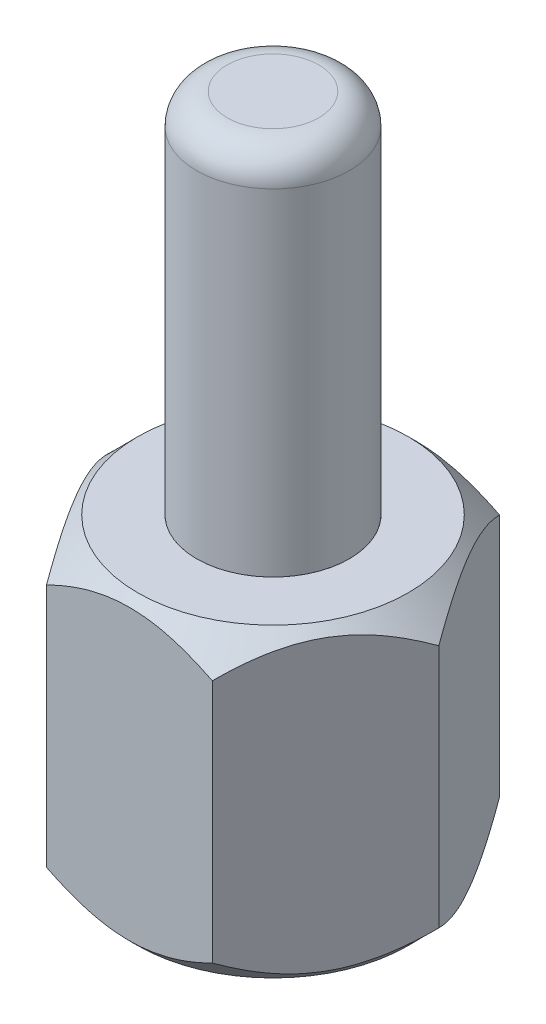
ISO-10303-21;
HEADER;
FILE_DESCRIPTION(('STEP AP214'),'2;1');
FILE_NAME('part.step','',(''),(''),'','','');
FILE_SCHEMA(('AUTOMOTIVE_DESIGN { 1 0 10303 214 1 1 1 1 }'));
ENDSEC;
DATA;
#1=APPLICATION_CONTEXT('core data for automotive mechanical design processes');
#2=APPLICATION_PROTOCOL_DEFINITION('international standard','automotive_design',2000,#1);
#3=PRODUCT_CONTEXT('',#1,'mechanical');
#4=PRODUCT('Part','Part','',(#3));
#5=PRODUCT_RELATED_PRODUCT_CATEGORY('part','',(#4));
#6=PRODUCT_DEFINITION_FORMATION('','',#4);
#7=PRODUCT_DEFINITION_CONTEXT('part definition',#1,'design');
#8=PRODUCT_DEFINITION('design','',#6,#7);
#9=PRODUCT_DEFINITION_SHAPE('','',#8);
#10=(LENGTH_UNIT() NAMED_UNIT(*) SI_UNIT(.MILLI.,.METRE.));
#11=(NAMED_UNIT(*) PLANE_ANGLE_UNIT() SI_UNIT($,.RADIAN.));
#12=(NAMED_UNIT(*) SI_UNIT($,.STERADIAN.) SOLID_ANGLE_UNIT());
#13=UNCERTAINTY_MEASURE_WITH_UNIT(LENGTH_MEASURE(1.E-05),#10,'distance_accuracy_value','');
#14=(GEOMETRIC_REPRESENTATION_CONTEXT(3) GLOBAL_UNCERTAINTY_ASSIGNED_CONTEXT((#13)) GLOBAL_UNIT_ASSIGNED_CONTEXT((#10,
#11,#12)) REPRESENTATION_CONTEXT('',''));
#15=CARTESIAN_POINT('',(0.,0.,0.));
#16=DIRECTION('',(0.,0.,1.));
#17=DIRECTION('',(1.,0.,0.));
#18=AXIS2_PLACEMENT_3D('',#15,#16,#17);
#19=CARTESIAN_POINT('',(0.,11.,0.));
#20=DIRECTION('',(0.,-1.,0.));
#21=DIRECTION('',(0.,0.,-1.));
#22=AXIS2_PLACEMENT_3D('',#19,#20,#21);
#23=CYLINDRICAL_SURFACE('',#22,1.25);
#24=CARTESIAN_POINT('',(0.,10.5,0.));
#25=DIRECTION('',(0.,1.,0.));
#26=DIRECTION('',(0.,0.,1.));
#27=AXIS2_PLACEMENT_3D('',#24,#25,#26);
#28=CIRCLE('',#27,1.25);
#29=CARTESIAN_POINT('',(0.,10.5,1.25));
#30=VERTEX_POINT('',#29);
#31=EDGE_CURVE('E11',#30,#30,#28,.F.);
#32=ORIENTED_EDGE('',*,*,#31,.T.);
#33=EDGE_LOOP('',(#32));
#34=FACE_BOUND('',#33,.T.);
#35=CARTESIAN_POINT('',(0.,5.,0.));
#36=DIRECTION('',(0.,1.,0.));
#37=DIRECTION('',(0.,0.,1.));
#38=AXIS2_PLACEMENT_3D('',#35,#36,#37);
#39=CIRCLE('',#38,1.25);
#40=CARTESIAN_POINT('',(0.,5.,1.25));
#41=VERTEX_POINT('',#40);
#42=EDGE_CURVE('E60',#41,#41,#39,.T.);
#43=ORIENTED_EDGE('',*,*,#42,.T.);
#44=EDGE_LOOP('',(#43));
#45=FACE_BOUND('',#44,.T.);
#46=ADVANCED_FACE('F49',(#34,#45),#23,.T.);
#47=CARTESIAN_POINT('',(0.,11.,0.));
#48=DIRECTION('',(0.,1.,0.));
#49=DIRECTION('',(0.,0.,1.));
#50=AXIS2_PLACEMENT_3D('',#47,#48,#49);
#51=PLANE('',#50);
#52=CARTESIAN_POINT('',(0.,11.,0.));
#53=DIRECTION('',(0.,1.,0.));
#54=DIRECTION('',(0.,0.,1.));
#55=AXIS2_PLACEMENT_3D('',#52,#53,#54);
#56=CIRCLE('',#55,0.75);
#57=CARTESIAN_POINT('',(0.,11.,0.75));
#58=VERTEX_POINT('',#57);
#59=EDGE_CURVE('E56',#58,#58,#56,.T.);
#60=ORIENTED_EDGE('',*,*,#59,.T.);
#61=EDGE_LOOP('',(#60));
#62=FACE_BOUND('',#61,.T.);
#63=ADVANCED_FACE('F70',(#62),#51,.T.);
#64=CARTESIAN_POINT('',(0.,5.,0.));
#65=DIRECTION('',(0.,1.,0.));
#66=DIRECTION('',(0.,0.,1.));
#67=AXIS2_PLACEMENT_3D('',#64,#65,#66);
#68=PLANE('',#67);
#69=ORIENTED_EDGE('',*,*,#42,.F.);
#70=EDGE_LOOP('',(#69));
#71=FACE_BOUND('',#70,.T.);
#72=ADVANCED_FACE('F68',(#71),#68,.F.);
#73=CARTESIAN_POINT('',(0.,10.5,0.));
#74=DIRECTION('',(0.,1.,0.));
#75=DIRECTION('',(0.,0.,1.));
#76=AXIS2_PLACEMENT_3D('',#73,#74,#75);
#77=TOROIDAL_SURFACE('',#76,0.75,0.5);
#78=ORIENTED_EDGE('',*,*,#31,.F.);
#79=EDGE_LOOP('',(#78));
#80=FACE_BOUND('',#79,.T.);
#81=ORIENTED_EDGE('',*,*,#59,.F.);
#82=EDGE_LOOP('',(#81));
#83=FACE_BOUND('',#82,.T.);
#84=ADVANCED_FACE('F51',(#80,#83),#77,.T.);
#85=CLOSED_SHELL('',(#46,#63,#72,#84));
#86=MANIFOLD_SOLID_BREP('B2',#85);
#87=CARTESIAN_POINT('',(1.35677313259565,5.,2.34999999999999));
#88=DIRECTION('',(-0.866025403784442,0.,-0.499999999999995));
#89=DIRECTION('',(-0.499999999999995,0.,0.866025403784442));
#90=AXIS2_PLACEMENT_3D('',#87,#88,#89);
#91=PLANE('',#90);
#92=CARTESIAN_POINT('',(2.71366173524508,0.500115477423953,-0.0002));
#93=CARTESIAN_POINT('',(2.66702181897453,0.453514420754859,0.0805827046413601));
#94=CARTESIAN_POINT('',(2.619602011949,0.409650231593762,0.162716219694685));
#95=CARTESIAN_POINT('',(2.5229077509184,0.329335803551844,0.33019559260002));
#96=CARTESIAN_POINT('',(2.47362410019065,0.292930253802987,0.415557379642964));
#97=CARTESIAN_POINT('',(2.37424596072594,0.230566757708877,0.5876853663575));
#98=CARTESIAN_POINT('',(2.3241767832868,0.20445205614839,0.674407725575281));
#99=CARTESIAN_POINT('',(2.22293612155872,0.164216868168013,0.84976169548021));
#100=CARTESIAN_POINT('',(2.17176773038475,0.150066345438939,0.938387948735085));
#101=CARTESIAN_POINT('',(2.08358239463315,0.137298959127492,1.09112943073937));
#102=CARTESIAN_POINT('',(2.04667938843036,0.135408895551209,1.15504731243464));
#103=CARTESIAN_POINT('',(1.97293369217404,0.138592545290331,1.28277860519013));
#104=CARTESIAN_POINT('',(1.93609102779937,0.143668700006083,1.34659197177326));
#105=CARTESIAN_POINT('',(1.86275357290835,0.160495922051711,1.47361616974231));
#106=CARTESIAN_POINT('',(1.82625921808281,0.172254456697003,1.53682624648958));
#107=CARTESIAN_POINT('',(1.75390158173959,0.201800980357544,1.66215334895163));
#108=CARTESIAN_POINT('',(1.71803825206632,0.219588507163031,1.72427045807434));
#109=CARTESIAN_POINT('',(1.62617552865636,0.272395503913701,1.88338136234204));
#110=CARTESIAN_POINT('',(1.57074576121927,0.311395733846911,1.97938853579481));
#111=CARTESIAN_POINT('',(1.48924118578274,0.377233579565032,2.12055860150021));
#112=CARTESIAN_POINT('',(1.46238179358799,0.400365987274775,2.16708043344193));
#113=CARTESIAN_POINT('',(1.40916054946841,0.44873951612495,2.25926233229908));
#114=CARTESIAN_POINT('',(1.38279840408548,0.473979342559169,2.30492290749882));
#115=CARTESIAN_POINT('',(1.35665766254181,0.500115477423953,2.35019999999999));
#116=B_SPLINE_CURVE_WITH_KNOTS('',3,(#92,#93,#94,#95,#96,#97,#98,#99,#100,#101,#102,#103,#104,
#105,#106,#107,#108,#109,#110,#111,#112,#113,#114,#115),.UNSPECIFIED.,.F.,.F.,(4,2,2,2,2,2,2,2,
2,2,2,4),(0.,0.313034643638936,0.627893288091257,0.937751034486846,1.24682854729337,
1.46800568908581,1.68926036503641,1.91076277253884,2.13224820250605,2.4840684999269,
2.65950165672958,2.83482781708433),.UNSPECIFIED.);
#117=CARTESIAN_POINT('',(2.71354626519124,0.5,0.));
#118=VERTEX_POINT('',#117);
#119=CARTESIAN_POINT('',(1.35677313259565,0.5,2.34999999999999));
#120=VERTEX_POINT('',#119);
#121=EDGE_CURVE('E121',#118,#120,#116,.T.);
#122=ORIENTED_EDGE('',*,*,#121,.F.);
#123=DIRECTION('',(0.,-1.,0.));
#124=VECTOR('',#123,1.);
#125=CARTESIAN_POINT('',(2.71354626519124,5.,0.));
#126=LINE('',#125,#124);
#127=CARTESIAN_POINT('',(2.71354626519124,4.5,0.));
#128=VERTEX_POINT('',#127);
#129=EDGE_CURVE('E47',#128,#118,#126,.T.);
#130=ORIENTED_EDGE('',*,*,#129,.F.);
#131=CARTESIAN_POINT('',(1.35665766254181,4.49988452257605,2.35019999999999));
#132=CARTESIAN_POINT('',(1.40329757881237,4.54648557924514,2.26941729535863));
#133=CARTESIAN_POINT('',(1.45071738583789,4.59034976840624,2.1872837803053));
#134=CARTESIAN_POINT('',(1.5474116468685,4.67066419644816,2.01980440739997));
#135=CARTESIAN_POINT('',(1.59669529759625,4.70706974619701,1.93444262035702));
#136=CARTESIAN_POINT('',(1.69607343706095,4.76943324229112,1.76231463364249));
#137=CARTESIAN_POINT('',(1.7461426145001,4.79554794385161,1.6755922744247));
#138=CARTESIAN_POINT('',(1.84738327622817,4.83578313183199,1.50023830451978));
#139=CARTESIAN_POINT('',(1.89855166740214,4.84993365456106,1.4116120512649));
#140=CARTESIAN_POINT('',(1.98673700315374,4.86270104087251,1.25887056926061));
#141=CARTESIAN_POINT('',(2.02364000935653,4.86459110444879,1.19495268756535));
#142=CARTESIAN_POINT('',(2.09738570561285,4.86140745470967,1.06722139480986));
#143=CARTESIAN_POINT('',(2.13422836998752,4.85633129999392,1.00340802822673));
#144=CARTESIAN_POINT('',(2.20756582487855,4.83950407794829,0.876383830257676));
#145=CARTESIAN_POINT('',(2.24406017970408,4.827745543303,0.813173753510401));
#146=CARTESIAN_POINT('',(2.3164178160473,4.79819901964246,0.687846651048354));
#147=CARTESIAN_POINT('',(2.35228114572057,4.78041149283697,0.625729541925647));
#148=CARTESIAN_POINT('',(2.44414386913054,4.7276044960863,0.466618637657944));
#149=CARTESIAN_POINT('',(2.49957363656762,4.68860426615309,0.370611464205181));
#150=CARTESIAN_POINT('',(2.58107821200415,4.62276642043497,0.22944139849978));
#151=CARTESIAN_POINT('',(2.6079376041989,4.59963401272523,0.182919566558058));
#152=CARTESIAN_POINT('',(2.66115884831848,4.55126048387505,0.0907376677009109));
#153=CARTESIAN_POINT('',(2.68752099370141,4.52602065744083,0.0450770925011711));
#154=CARTESIAN_POINT('',(2.71366173524508,4.49988452257605,-0.000199999999999669));
#155=B_SPLINE_CURVE_WITH_KNOTS('',3,(#131,#132,#133,#134,#135,#136,#137,#138,#139,#140,#141,
#142,#143,#144,#145,#146,#147,#148,#149,#150,#151,#152,#153,#154),.UNSPECIFIED.,.F.,.F.,(4,2,2,
2,2,2,2,2,2,2,2,4),(0.,0.313034643638935,0.627893288091257,0.937751034486846,1.24682854729337,
1.46800568908581,1.68926036503641,1.91076277253884,2.13224820250605,2.4840684999269,
2.65950165672958,2.83482781708433),.UNSPECIFIED.);
#156=CARTESIAN_POINT('',(1.35677313259565,4.5,2.34999999999999));
#157=VERTEX_POINT('',#156);
#158=EDGE_CURVE('E204',#157,#128,#155,.T.);
#159=ORIENTED_EDGE('',*,*,#158,.F.);
#160=DIRECTION('',(0.,-1.,0.));
#161=VECTOR('',#160,1.);
#162=CARTESIAN_POINT('',(1.35677313259565,5.,2.34999999999999));
#163=LINE('',#162,#161);
#164=EDGE_CURVE('E192',#157,#120,#163,.T.);
#165=ORIENTED_EDGE('',*,*,#164,.T.);
#166=EDGE_LOOP('',(#122,#130,#159,#165));
#167=FACE_BOUND('',#166,.T.);
#168=ADVANCED_FACE('F105',(#167),#91,.F.);
#169=CARTESIAN_POINT('',(2.71354626519124,5.,0.));
#170=DIRECTION('',(-0.866025403784438,0.,0.500000000000001));
#171=DIRECTION('',(0.500000000000001,0.,0.866025403784438));
#172=AXIS2_PLACEMENT_3D('',#169,#170,#171);
#173=PLANE('',#172);
#174=CARTESIAN_POINT('',(1.35665766254178,0.500115477423953,-2.3502));
#175=CARTESIAN_POINT('',(1.40329757881233,0.453514420754858,-2.26941729535864));
#176=CARTESIAN_POINT('',(1.45071738583786,0.40965023159376,-2.18728378030532));
#177=CARTESIAN_POINT('',(1.54741164686847,0.329335803551841,-2.01980440739998));
#178=CARTESIAN_POINT('',(1.59669529759622,0.292930253802982,-1.93444262035704));
#179=CARTESIAN_POINT('',(1.69607343706093,0.230566757708871,-1.7623146336425));
#180=CARTESIAN_POINT('',(1.74614261450007,0.204452056148383,-1.67559227442472));
#181=CARTESIAN_POINT('',(1.84738327622815,0.164216868168005,-1.50023830451979));
#182=CARTESIAN_POINT('',(1.89855166740212,0.150066345438931,-1.41161205126491));
#183=CARTESIAN_POINT('',(1.98673700315372,0.137298959127483,-1.25887056926063));
#184=CARTESIAN_POINT('',(2.02364000935651,0.135408895551199,-1.19495268756536));
#185=CARTESIAN_POINT('',(2.09738570561283,0.138592545290321,-1.06722139480987));
#186=CARTESIAN_POINT('',(2.1342283699875,0.143668700006073,-1.00340802822674));
#187=CARTESIAN_POINT('',(2.20756582487853,0.160495922051701,-0.87638383025769));
#188=CARTESIAN_POINT('',(2.24406017970407,0.172254456696994,-0.813173753510416));
#189=CARTESIAN_POINT('',(2.31641781604728,0.201800980357535,-0.68784665104837));
#190=CARTESIAN_POINT('',(2.35228114572056,0.219588507163021,-0.625729541925663));
#191=CARTESIAN_POINT('',(2.44414386913052,0.272395503913691,-0.466618637657957));
#192=CARTESIAN_POINT('',(2.49957363656761,0.311395733846903,-0.370611464205191));
#193=CARTESIAN_POINT('',(2.58107821200415,0.377233579565027,-0.229441398499786));
#194=CARTESIAN_POINT('',(2.6079376041989,0.400365987274771,-0.182919566558063));
#195=CARTESIAN_POINT('',(2.66115884831848,0.448739516124947,-0.0907376677009132));
#196=CARTESIAN_POINT('',(2.68752099370141,0.473979342559168,-0.0450770925011719));
#197=CARTESIAN_POINT('',(2.71366173524508,0.500115477423953,0.000199999999999927));
#198=B_SPLINE_CURVE_WITH_KNOTS('',3,(#174,#175,#176,#177,#178,#179,#180,#181,#182,#183,#184,
#185,#186,#187,#188,#189,#190,#191,#192,#193,#194,#195,#196,#197),.UNSPECIFIED.,.F.,.F.,(4,2,2,
2,2,2,2,2,2,2,2,4),(0.,0.313034643638939,0.627893288091265,0.937751034486858,1.24682854729339,
1.46800568908582,1.68926036503642,1.91076277253886,2.13224820250607,2.48406849992692,
2.65950165672961,2.83482781708436),.UNSPECIFIED.);
#199=CARTESIAN_POINT('',(1.35677313259562,0.5,-2.35));
#200=VERTEX_POINT('',#199);
#201=EDGE_CURVE('E160',#200,#118,#198,.T.);
#202=ORIENTED_EDGE('',*,*,#201,.F.);
#203=DIRECTION('',(0.,-1.,0.));
#204=VECTOR('',#203,1.);
#205=CARTESIAN_POINT('',(1.35677313259562,5.,-2.35));
#206=LINE('',#205,#204);
#207=CARTESIAN_POINT('',(1.35677313259562,4.5,-2.35));
#208=VERTEX_POINT('',#207);
#209=EDGE_CURVE('E114',#208,#200,#206,.T.);
#210=ORIENTED_EDGE('',*,*,#209,.F.);
#211=CARTESIAN_POINT('',(2.71366173524508,4.49988452257605,0.0002));
#212=CARTESIAN_POINT('',(2.66702181897452,4.54648557924514,-0.0805827046413607));
#213=CARTESIAN_POINT('',(2.619602011949,4.59034976840624,-0.162716219694686));
#214=CARTESIAN_POINT('',(2.52290775091839,4.67066419644816,-0.330195592600022));
#215=CARTESIAN_POINT('',(2.47362410019064,4.70706974619702,-0.415557379642967));
#216=CARTESIAN_POINT('',(2.37424596072593,4.76943324229113,-0.587685366357504));
#217=CARTESIAN_POINT('',(2.32417678328679,4.79554794385162,-0.674407725575286));
#218=CARTESIAN_POINT('',(2.22293612155871,4.835783131832,-0.849761695480216));
#219=CARTESIAN_POINT('',(2.17176773038473,4.84993365456107,-0.938387948735092));
#220=CARTESIAN_POINT('',(2.08358239463314,4.86270104087252,-1.09112943073938));
#221=CARTESIAN_POINT('',(2.04667938843035,4.8645911044488,-1.15504731243464));
#222=CARTESIAN_POINT('',(1.97293369217403,4.86140745470968,-1.28277860519013));
#223=CARTESIAN_POINT('',(1.93609102779936,4.85633129999393,-1.34659197177326));
#224=CARTESIAN_POINT('',(1.86275357290833,4.8395040779483,-1.47361616974231));
#225=CARTESIAN_POINT('',(1.82625921808279,4.82774554330301,-1.53682624648959));
#226=CARTESIAN_POINT('',(1.75390158173958,4.79819901964247,-1.66215334895163));
#227=CARTESIAN_POINT('',(1.7180382520663,4.78041149283698,-1.72427045807434));
#228=CARTESIAN_POINT('',(1.62617552865633,4.72760449608631,-1.88338136234205));
#229=CARTESIAN_POINT('',(1.57074576121925,4.6886042661531,-1.97938853579481));
#230=CARTESIAN_POINT('',(1.48924118578271,4.62276642043497,-2.12055860150022));
#231=CARTESIAN_POINT('',(1.46238179358796,4.59963401272523,-2.16708043344194));
#232=CARTESIAN_POINT('',(1.40916054946838,4.55126048387505,-2.25926233229909));
#233=CARTESIAN_POINT('',(1.38279840408545,4.52602065744083,-2.30492290749883));
#234=CARTESIAN_POINT('',(1.35665766254178,4.49988452257605,-2.3502));
#235=B_SPLINE_CURVE_WITH_KNOTS('',3,(#211,#212,#213,#214,#215,#216,#217,#218,#219,#220,#221,
#222,#223,#224,#225,#226,#227,#228,#229,#230,#231,#232,#233,#234),.UNSPECIFIED.,.F.,.F.,(4,2,2,
2,2,2,2,2,2,2,2,4),(0.,0.31303464363894,0.627893288091266,0.937751034486858,1.24682854729339,
1.46800568908582,1.68926036503642,1.91076277253886,2.13224820250607,2.48406849992692,
2.65950165672961,2.83482781708436),.UNSPECIFIED.);
#236=EDGE_CURVE('E212',#128,#208,#235,.T.);
#237=ORIENTED_EDGE('',*,*,#236,.F.);
#238=ORIENTED_EDGE('',*,*,#129,.T.);
#239=EDGE_LOOP('',(#202,#210,#237,#238));
#240=FACE_BOUND('',#239,.T.);
#241=ADVANCED_FACE('F171',(#240),#173,.F.);
#242=CARTESIAN_POINT('',(1.35677313259562,5.,-2.35));
#243=DIRECTION('',(0.,0.,1.));
#244=DIRECTION('',(1.,0.,0.));
#245=AXIS2_PLACEMENT_3D('',#242,#243,#244);
#246=PLANE('',#245);
#247=CARTESIAN_POINT('',(-4.11620007747229,2.52624308432449,-2.34999999999999));
#248=CARTESIAN_POINT('',(-3.99456062407984,2.4206482959392,-2.34999999999999));
#249=CARTESIAN_POINT('',(-3.87238420139626,2.31565939195618,-2.34999999999999));
#250=CARTESIAN_POINT('',(-3.62654046205172,2.10732553559251,-2.34999999999999));
#251=CARTESIAN_POINT('',(-3.50287246949324,2.00398138180499,-2.34999999999999));
#252=CARTESIAN_POINT('',(-3.25092428246666,1.79715607348113,-2.34999999999999));
#253=CARTESIAN_POINT('',(-3.1226030423497,1.69372472451252,-2.34999999999999));
#254=CARTESIAN_POINT('',(-2.86355572230193,1.48997092714895,-2.34999999999999));
#255=CARTESIAN_POINT('',(-2.73283025157603,1.38964770802441,-2.34999999999999));
#256=CARTESIAN_POINT('',(-2.46800641513511,1.1931600446047,-2.34999999999999));
#257=CARTESIAN_POINT('',(-2.3339038896,1.09700117040959,-2.34999999999999));
#258=CARTESIAN_POINT('',(-2.0613032743926,0.91079914756065,-2.34999999999999));
#259=CARTESIAN_POINT('',(-1.92280172588298,0.820760995346966,-2.34999999999999));
#260=CARTESIAN_POINT('',(-1.64117355798615,0.650614047542824,-2.34999999999999));
#261=CARTESIAN_POINT('',(-1.49808943768717,0.570435820386811,-2.34999999999999));
#262=CARTESIAN_POINT('',(-1.20485643379896,0.42427173930638,-2.35));
#263=CARTESIAN_POINT('',(-1.05472107043102,0.358259975814248,-2.35));
#264=CARTESIAN_POINT('',(-0.821865462112484,0.274942485534352,-2.35));
#265=CARTESIAN_POINT('',(-0.742036508278309,0.249595685883112,-2.35));
#266=CARTESIAN_POINT('',(-0.580476501018404,0.205835788601102,-2.35));
#267=CARTESIAN_POINT('',(-0.498745753007965,0.18742158569135,-2.35));
#268=CARTESIAN_POINT('',(-0.334372246307212,0.158753654737759,-2.35));
#269=CARTESIAN_POINT('',(-0.251738546335379,0.148448964635504,-2.35));
#270=CARTESIAN_POINT('',(-0.0858407417653273,0.136566289649941,-2.35));
#271=CARTESIAN_POINT('',(-0.00257670926849666,0.134987321327512,-2.35));
#272=CARTESIAN_POINT('',(0.163777303536677,0.140683761884498,-2.35));
#273=CARTESIAN_POINT('',(0.24686677648784,0.147973655828652,-2.35));
#274=CARTESIAN_POINT('',(0.411882632160692,0.170874266382378,-2.35));
#275=CARTESIAN_POINT('',(0.493808778405908,0.186486650583509,-2.35));
#276=CARTESIAN_POINT('',(0.656483138387227,0.225136666290385,-2.35));
#277=CARTESIAN_POINT('',(0.737218600446383,0.24822702200939,-2.35));
#278=CARTESIAN_POINT('',(0.896635135917363,0.300570119750988,-2.35));
#279=CARTESIAN_POINT('',(0.975316175413216,0.329822963436416,-2.35));
#280=CARTESIAN_POINT('',(1.14744588710945,0.40020384861402,-2.35));
#281=CARTESIAN_POINT('',(1.24039977634964,0.44253155797546,-2.35));
#282=CARTESIAN_POINT('',(1.42354442733167,0.532838194315101,-2.35));
#283=CARTESIAN_POINT('',(1.51373356413395,0.580820367305655,-2.35));
#284=CARTESIAN_POINT('',(1.69185571070467,0.68118216070971,-2.35000000000001));
#285=CARTESIAN_POINT('',(1.77978369059034,0.733570635503713,-2.35000000000001));
#286=CARTESIAN_POINT('',(1.95354761418705,0.84164994067303,-2.35000000000001));
#287=CARTESIAN_POINT('',(2.03938396636662,0.897340118855269,-2.35000000000001));
#288=CARTESIAN_POINT('',(2.20977468778743,1.01160311087831,-2.35000000000001));
#289=CARTESIAN_POINT('',(2.29431973959119,1.07018975488299,-2.35000000000001));
#290=CARTESIAN_POINT('',(2.46194608751648,1.18942577021326,-2.35000000000001));
#291=CARTESIAN_POINT('',(2.5450272725073,1.25007529712891,-2.35000000000001));
#292=CARTESIAN_POINT('',(2.79224195212483,1.43432754969047,-2.35000000000001));
#293=CARTESIAN_POINT('',(2.95455149425202,1.56037440725253,-2.35000000000001));
#294=CARTESIAN_POINT('',(3.28611603645723,1.82508053476039,-2.35000000000001));
#295=CARTESIAN_POINT('',(3.45513899155155,1.96402766342604,-2.35000000000001));
#296=CARTESIAN_POINT('',(3.70562895012553,2.17418356155825,-2.35000000000001));
#297=CARTESIAN_POINT('',(3.78816309544242,2.24412720654322,-2.35000000000001));
#298=CARTESIAN_POINT('',(3.95261548683786,2.38469838643999,-2.35000000000001));
#299=CARTESIAN_POINT('',(4.03453386561131,2.45532576604052,-2.35000000000001));
#300=CARTESIAN_POINT('',(4.11620007747227,2.5262430843245,-2.35000000000001));
#301=B_SPLINE_CURVE_WITH_KNOTS('',3,(#247,#248,#249,#250,#251,#252,#253,#254,#255,#256,#257,
#258,#259,#260,#261,#262,#263,#264,#265,#266,#267,#268,#269,#270,#271,#272,#273,#274,#275,#276,
#277,#278,#279,#280,#281,#282,#283,#284,#285,#286,#287,#288,#289,#290,#291,#292,#293,#294,#295,
#296,#297,#298,#299,#300),.UNSPECIFIED.,.F.,.F.,(4,2,2,2,2,2,2,2,2,2,2,2,2,2,2,2,2,2,2,2,2,2,2,
2,2,2,4),(0.,0.483247159798947,0.96672220657701,1.46113633492303,1.95542686476531,
2.45035931762353,2.94569105676271,3.43730630445939,3.92801460806787,4.17903396485375,
4.43001328411246,4.67940250839623,4.92876362450418,5.17853255685014,5.42835155464483,
5.67997173963929,5.93159607594807,6.2377494192109,6.5440793775366,6.85104032130648,
7.15794083110096,7.46648353445716,7.77504956104604,8.39143691317244,9.04779093244822,
9.37234292136602,9.6968228413157),.UNSPECIFIED.);
#302=CARTESIAN_POINT('',(-1.35677313259563,0.5,-2.35));
#303=VERTEX_POINT('',#302);
#304=EDGE_CURVE('E157',#303,#200,#301,.T.);
#305=ORIENTED_EDGE('',*,*,#304,.F.);
#306=DIRECTION('',(0.,-1.,0.));
#307=VECTOR('',#306,1.);
#308=CARTESIAN_POINT('',(-1.35677313259563,5.,-2.35));
#309=LINE('',#308,#307);
#310=CARTESIAN_POINT('',(-1.35677313259563,4.5,-2.35));
#311=VERTEX_POINT('',#310);
#312=EDGE_CURVE('E180',#311,#303,#309,.T.);
#313=ORIENTED_EDGE('',*,*,#312,.F.);
#314=CARTESIAN_POINT('',(4.11620007747227,2.47375691567551,-2.35000000000001));
#315=CARTESIAN_POINT('',(3.99456062407982,2.5793517040608,-2.35000000000001));
#316=CARTESIAN_POINT('',(3.87238420139625,2.68434060804382,-2.35000000000001));
#317=CARTESIAN_POINT('',(3.62654046205171,2.89267446440749,-2.35000000000001));
#318=CARTESIAN_POINT('',(3.50287246949323,2.99601861819501,-2.35000000000001));
#319=CARTESIAN_POINT('',(3.25092428246665,3.20284392651887,-2.35000000000001));
#320=CARTESIAN_POINT('',(3.12260304234969,3.30627527548748,-2.35000000000001));
#321=CARTESIAN_POINT('',(2.86355572230191,3.51002907285104,-2.35000000000001));
#322=CARTESIAN_POINT('',(2.73283025157602,3.61035229197559,-2.35000000000001));
#323=CARTESIAN_POINT('',(2.4680064151351,3.8068399553953,-2.35000000000001));
#324=CARTESIAN_POINT('',(2.33390388959999,3.90299882959041,-2.35000000000001));
#325=CARTESIAN_POINT('',(2.06130327439258,4.08920085243935,-2.35000000000001));
#326=CARTESIAN_POINT('',(1.92280172588297,4.17923900465303,-2.35000000000001));
#327=CARTESIAN_POINT('',(1.64117355798613,4.34938595245718,-2.35000000000001));
#328=CARTESIAN_POINT('',(1.49808943768716,4.42956417961319,-2.35));
#329=CARTESIAN_POINT('',(1.20485643379894,4.57572826069362,-2.35));
#330=CARTESIAN_POINT('',(1.054721070431,4.64174002418575,-2.35));
#331=CARTESIAN_POINT('',(0.82186546211247,4.72505751446565,-2.35));
#332=CARTESIAN_POINT('',(0.742036508278295,4.75040431411689,-2.35));
#333=CARTESIAN_POINT('',(0.58047650101839,4.7941642113989,-2.35));
#334=CARTESIAN_POINT('',(0.498745753007951,4.81257841430865,-2.35));
#335=CARTESIAN_POINT('',(0.334372246307198,4.84124634526224,-2.35));
#336=CARTESIAN_POINT('',(0.251738546335365,4.8515510353645,-2.35));
#337=CARTESIAN_POINT('',(0.0858407417653138,4.86343371035006,-2.35));
#338=CARTESIAN_POINT('',(0.002576709268483,4.86501267867249,-2.35));
#339=CARTESIAN_POINT('',(-0.163777303536691,4.8593162381155,-2.35));
#340=CARTESIAN_POINT('',(-0.246866776487854,4.85202634417135,-2.35));
#341=CARTESIAN_POINT('',(-0.411882632160706,4.82912573361762,-2.35));
#342=CARTESIAN_POINT('',(-0.493808778405921,4.81351334941649,-2.35));
#343=CARTESIAN_POINT('',(-0.656483138387241,4.77486333370962,-2.35));
#344=CARTESIAN_POINT('',(-0.737218600446397,4.75177297799061,-2.35));
#345=CARTESIAN_POINT('',(-0.896635135917376,4.69942988024901,-2.35));
#346=CARTESIAN_POINT('',(-0.97531617541323,4.67017703656358,-2.35));
#347=CARTESIAN_POINT('',(-1.14744588710946,4.59979615138598,-2.35));
#348=CARTESIAN_POINT('',(-1.24039977634965,4.55746844202454,-2.35));
#349=CARTESIAN_POINT('',(-1.42354442733168,4.4671618056849,-2.34999999999999));
#350=CARTESIAN_POINT('',(-1.51373356413396,4.41917963269435,-2.34999999999999));
#351=CARTESIAN_POINT('',(-1.69185571070469,4.31881783929029,-2.34999999999999));
#352=CARTESIAN_POINT('',(-1.77978369059035,4.26642936449629,-2.34999999999999));
#353=CARTESIAN_POINT('',(-1.95354761418706,4.15835005932697,-2.34999999999999));
#354=CARTESIAN_POINT('',(-2.03938396636663,4.10265988114474,-2.34999999999999));
#355=CARTESIAN_POINT('',(-2.20977468778744,3.98839688912169,-2.34999999999999));
#356=CARTESIAN_POINT('',(-2.2943197395912,3.92981024511702,-2.34999999999999));
#357=CARTESIAN_POINT('',(-2.46194608751649,3.81057422978675,-2.34999999999999));
#358=CARTESIAN_POINT('',(-2.54502727250731,3.74992470287109,-2.34999999999999));
#359=CARTESIAN_POINT('',(-2.79224195212484,3.56567245030953,-2.34999999999999));
#360=CARTESIAN_POINT('',(-2.95455149425203,3.43962559274748,-2.34999999999999));
#361=CARTESIAN_POINT('',(-3.28611603645724,3.17491946523962,-2.34999999999999));
#362=CARTESIAN_POINT('',(-3.45513899155156,3.03597233657396,-2.34999999999999));
#363=CARTESIAN_POINT('',(-3.70562895012554,2.82581643844175,-2.34999999999999));
#364=CARTESIAN_POINT('',(-3.78816309544243,2.75587279345678,-2.34999999999999));
#365=CARTESIAN_POINT('',(-3.95261548683787,2.61530161356001,-2.34999999999999));
#366=CARTESIAN_POINT('',(-4.03453386561132,2.54467423395948,-2.34999999999999));
#367=CARTESIAN_POINT('',(-4.11620007747229,2.47375691567551,-2.34999999999999));
#368=B_SPLINE_CURVE_WITH_KNOTS('',3,(#314,#315,#316,#317,#318,#319,#320,#321,#322,#323,#324,
#325,#326,#327,#328,#329,#330,#331,#332,#333,#334,#335,#336,#337,#338,#339,#340,#341,#342,#343,
#344,#345,#346,#347,#348,#349,#350,#351,#352,#353,#354,#355,#356,#357,#358,#359,#360,#361,#362,
#363,#364,#365,#366,#367),.UNSPECIFIED.,.F.,.F.,(4,2,2,2,2,2,2,2,2,2,2,2,2,2,2,2,2,2,2,2,2,2,2,
2,2,2,4),(0.,0.483247159798946,0.966722206577009,1.46113633492303,1.95542686476531,
2.45035931762353,2.94569105676271,3.43730630445939,3.92801460806787,4.17903396485375,
4.43001328411246,4.67940250839622,4.92876362450418,5.17853255685014,5.42835155464483,
5.67997173963929,5.93159607594806,6.23774941921089,6.5440793775366,6.85104032130647,
7.15794083110095,7.46648353445715,7.77504956104603,8.39143691317243,9.04779093244822,
9.37234292136602,9.69682284131569),.UNSPECIFIED.);
#369=EDGE_CURVE('E178',#208,#311,#368,.T.);
#370=ORIENTED_EDGE('',*,*,#369,.F.);
#371=ORIENTED_EDGE('',*,*,#209,.T.);
#372=EDGE_LOOP('',(#305,#313,#370,#371));
#373=FACE_BOUND('',#372,.T.);
#374=ADVANCED_FACE('F177',(#373),#246,.F.);
#375=CARTESIAN_POINT('',(-1.35677313259563,5.,-2.35));
#376=DIRECTION('',(0.866025403784442,0.,0.499999999999995));
#377=DIRECTION('',(0.499999999999995,0.,-0.866025403784442));
#378=AXIS2_PLACEMENT_3D('',#375,#376,#377);
#379=PLANE('',#378);
#380=CARTESIAN_POINT('',(-2.71366173524508,0.500115477423953,0.000200000000018949));
#381=CARTESIAN_POINT('',(-2.66702181897453,0.453514420754858,-0.080582704641342));
#382=CARTESIAN_POINT('',(-2.619602011949,0.40965023159376,-0.162716219694667));
#383=CARTESIAN_POINT('',(-2.52290775091839,0.32933580355184,-0.330195592600005));
#384=CARTESIAN_POINT('',(-2.47362410019064,0.292930253802982,-0.415557379642949));
#385=CARTESIAN_POINT('',(-2.37424596072594,0.23056675770887,-0.587685366357487));
#386=CARTESIAN_POINT('',(-2.32417678328679,0.204452056148383,-0.67440772557527));
#387=CARTESIAN_POINT('',(-2.22293612155871,0.164216868168005,-0.8497616954802));
#388=CARTESIAN_POINT('',(-2.17176773038474,0.150066345438931,-0.938387948735077));
#389=CARTESIAN_POINT('',(-2.08358239463315,0.137298959127483,-1.09112943073936));
#390=CARTESIAN_POINT('',(-2.04667938843035,0.135408895551199,-1.15504731243463));
#391=CARTESIAN_POINT('',(-1.97293369217403,0.138592545290321,-1.28277860519012));
#392=CARTESIAN_POINT('',(-1.93609102779937,0.143668700006073,-1.34659197177325));
#393=CARTESIAN_POINT('',(-1.86275357290834,0.160495922051701,-1.4736161697423));
#394=CARTESIAN_POINT('',(-1.8262592180828,0.172254456696993,-1.53682624648958));
#395=CARTESIAN_POINT('',(-1.75390158173959,0.201800980357534,-1.66215334895162));
#396=CARTESIAN_POINT('',(-1.71803825206631,0.219588507163021,-1.72427045807433));
#397=CARTESIAN_POINT('',(-1.62617552865635,0.272395503913691,-1.88338136234204));
#398=CARTESIAN_POINT('',(-1.57074576121926,0.311395733846903,-1.9793885357948));
#399=CARTESIAN_POINT('',(-1.48924118578273,0.377233579565026,-2.12055860150021));
#400=CARTESIAN_POINT('',(-1.46238179358798,0.40036598727477,-2.16708043344193));
#401=CARTESIAN_POINT('',(-1.40916054946839,0.448739516124947,-2.25926233229908));
#402=CARTESIAN_POINT('',(-1.38279840408547,0.473979342559168,-2.30492290749882));
#403=CARTESIAN_POINT('',(-1.35665766254179,0.500115477423953,-2.3502));
#404=B_SPLINE_CURVE_WITH_KNOTS('',3,(#380,#381,#382,#383,#384,#385,#386,#387,#388,#389,#390,
#391,#392,#393,#394,#395,#396,#397,#398,#399,#400,#401,#402,#403),.UNSPECIFIED.,.F.,.F.,(4,2,2,
2,2,2,2,2,2,2,2,4),(0.,0.313034643638939,0.627893288091265,0.937751034486857,1.24682854729339,
1.46800568908582,1.68926036503642,1.91076277253886,2.13224820250607,2.48406849992693,
2.65950165672961,2.83482781708437),.UNSPECIFIED.);
#405=CARTESIAN_POINT('',(-2.71354626519124,0.5,0.));
#406=VERTEX_POINT('',#405);
#407=EDGE_CURVE('E162',#406,#303,#404,.T.);
#408=ORIENTED_EDGE('',*,*,#407,.F.);
#409=DIRECTION('',(0.,-1.,0.));
#410=VECTOR('',#409,1.);
#411=CARTESIAN_POINT('',(-2.71354626519124,5.,0.));
#412=LINE('',#411,#410);
#413=CARTESIAN_POINT('',(-2.71354626519124,4.5,0.));
#414=VERTEX_POINT('',#413);
#415=EDGE_CURVE('E182',#414,#406,#412,.T.);
#416=ORIENTED_EDGE('',*,*,#415,.F.);
#417=CARTESIAN_POINT('',(-1.35665766254179,4.49988452257605,-2.3502));
#418=CARTESIAN_POINT('',(-1.40329757881235,4.54648557924514,-2.26941729535863));
#419=CARTESIAN_POINT('',(-1.45071738583788,4.59034976840624,-2.18728378030531));
#420=CARTESIAN_POINT('',(-1.54741164686848,4.67066419644816,-2.01980440739997));
#421=CARTESIAN_POINT('',(-1.59669529759623,4.70706974619702,-1.93444262035703));
#422=CARTESIAN_POINT('',(-1.69607343706094,4.76943324229113,-1.76231463364249));
#423=CARTESIAN_POINT('',(-1.74614261450008,4.79554794385162,-1.67559227442471));
#424=CARTESIAN_POINT('',(-1.84738327622816,4.83578313183199,-1.50023830451978));
#425=CARTESIAN_POINT('',(-1.89855166740213,4.84993365456107,-1.4116120512649));
#426=CARTESIAN_POINT('',(-1.98673700315373,4.86270104087252,-1.25887056926061));
#427=CARTESIAN_POINT('',(-2.02364000935652,4.8645911044488,-1.19495268756535));
#428=CARTESIAN_POINT('',(-2.09738570561284,4.86140745470968,-1.06722139480986));
#429=CARTESIAN_POINT('',(-2.13422836998751,4.85633129999393,-1.00340802822673));
#430=CARTESIAN_POINT('',(-2.20756582487853,4.8395040779483,-0.876383830257678));
#431=CARTESIAN_POINT('',(-2.24406017970407,4.82774554330301,-0.813173753510403));
#432=CARTESIAN_POINT('',(-2.31641781604729,4.79819901964247,-0.687846651048357));
#433=CARTESIAN_POINT('',(-2.35228114572056,4.78041149283698,-0.62572954192565));
#434=CARTESIAN_POINT('',(-2.44414386913053,4.72760449608631,-0.466618637657943));
#435=CARTESIAN_POINT('',(-2.49957363656762,4.6886042661531,-0.370611464205176));
#436=CARTESIAN_POINT('',(-2.58107821200415,4.62276642043497,-0.22944139849977));
#437=CARTESIAN_POINT('',(-2.6079376041989,4.59963401272523,-0.182919566558046));
#438=CARTESIAN_POINT('',(-2.66115884831848,4.55126048387505,-0.0907376677008954));
#439=CARTESIAN_POINT('',(-2.68752099370141,4.52602065744083,-0.0450770925011538));
#440=CARTESIAN_POINT('',(-2.71366173524508,4.49988452257605,0.000200000000018585));
#441=B_SPLINE_CURVE_WITH_KNOTS('',3,(#417,#418,#419,#420,#421,#422,#423,#424,#425,#426,#427,
#428,#429,#430,#431,#432,#433,#434,#435,#436,#437,#438,#439,#440),.UNSPECIFIED.,.F.,.F.,(4,2,2,
2,2,2,2,2,2,2,2,4),(0.,0.31303464363894,0.627893288091264,0.937751034486856,1.24682854729338,
1.46800568908582,1.68926036503642,1.91076277253885,2.13224820250606,2.48406849992692,
2.65950165672961,2.83482781708436),.UNSPECIFIED.);
#442=EDGE_CURVE('E247',#311,#414,#441,.T.);
#443=ORIENTED_EDGE('',*,*,#442,.F.);
#444=ORIENTED_EDGE('',*,*,#312,.T.);
#445=EDGE_LOOP('',(#408,#416,#443,#444));
#446=FACE_BOUND('',#445,.T.);
#447=ADVANCED_FACE('F261',(#446),#379,.F.);
#448=CARTESIAN_POINT('',(-2.71354626519124,5.,0.));
#449=DIRECTION('',(0.866025403784434,0.,-0.500000000000007));
#450=DIRECTION('',(-0.500000000000007,0.,-0.866025403784435));
#451=AXIS2_PLACEMENT_3D('',#448,#449,#450);
#452=PLANE('',#451);
#453=CARTESIAN_POINT('',(-1.35665766254176,0.500115477423953,2.35020000000001));
#454=CARTESIAN_POINT('',(-1.40329757881232,0.453514420754859,2.26941729535865));
#455=CARTESIAN_POINT('',(-1.45071738583785,0.40965023159376,2.18728378030533));
#456=CARTESIAN_POINT('',(-1.54741164686845,0.32933580355184,2.01980440739999));
#457=CARTESIAN_POINT('',(-1.59669529759621,0.292930253802982,1.93444262035705));
#458=CARTESIAN_POINT('',(-1.69607343706091,0.23056675770887,1.76231463364251));
#459=CARTESIAN_POINT('',(-1.74614261450006,0.204452056148382,1.67559227442473));
#460=CARTESIAN_POINT('',(-1.84738327622814,0.164216868168005,1.5002383045198));
#461=CARTESIAN_POINT('',(-1.89855166740211,0.15006634543893,1.41161205126493));
#462=CARTESIAN_POINT('',(-1.98673700315371,0.137298959127483,1.25887056926064));
#463=CARTESIAN_POINT('',(-2.0236400093565,0.135408895551199,1.19495268756537));
#464=CARTESIAN_POINT('',(-2.09738570561283,0.138592545290321,1.06722139480989));
#465=CARTESIAN_POINT('',(-2.13422836998749,0.143668700006073,1.00340802822676));
#466=CARTESIAN_POINT('',(-2.20756582487852,0.160495922051701,0.876383830257706));
#467=CARTESIAN_POINT('',(-2.24406017970406,0.172254456696993,0.813173753510432));
#468=CARTESIAN_POINT('',(-2.31641781604728,0.201800980357534,0.687846651048386));
#469=CARTESIAN_POINT('',(-2.35228114572055,0.219588507163021,0.62572954192568));
#470=CARTESIAN_POINT('',(-2.44414386913052,0.272395503913691,0.466618637657975));
#471=CARTESIAN_POINT('',(-2.49957363656761,0.311395733846904,0.370611464205209));
#472=CARTESIAN_POINT('',(-2.58107821200415,0.377233579565027,0.229441398499804));
#473=CARTESIAN_POINT('',(-2.60793760419889,0.40036598727477,0.182919566558081));
#474=CARTESIAN_POINT('',(-2.66115884831848,0.448739516124947,0.0907376677009317));
#475=CARTESIAN_POINT('',(-2.68752099370141,0.473979342559167,0.0450770925011906));
#476=CARTESIAN_POINT('',(-2.71366173524508,0.500115477423953,-0.000199999999981075));
#477=B_SPLINE_CURVE_WITH_KNOTS('',3,(#453,#454,#455,#456,#457,#458,#459,#460,#461,#462,#463,
#464,#465,#466,#467,#468,#469,#470,#471,#472,#473,#474,#475,#476),.UNSPECIFIED.,.F.,.F.,(4,2,2,
2,2,2,2,2,2,2,2,4),(0.,0.31303464363894,0.627893288091266,0.937751034486858,1.24682854729339,
1.46800568908582,1.68926036503642,1.91076277253886,2.13224820250607,2.48406849992693,
2.65950165672961,2.83482781708436),.UNSPECIFIED.);
#478=CARTESIAN_POINT('',(-1.3567731325956,0.5,2.35000000000001));
#479=VERTEX_POINT('',#478);
#480=EDGE_CURVE('E301',#479,#406,#477,.T.);
#481=ORIENTED_EDGE('',*,*,#480,.F.);
#482=DIRECTION('',(0.,-1.,0.));
#483=VECTOR('',#482,1.);
#484=CARTESIAN_POINT('',(-1.3567731325956,5.,2.35000000000001));
#485=LINE('',#484,#483);
#486=CARTESIAN_POINT('',(-1.3567731325956,4.5,2.35000000000001));
#487=VERTEX_POINT('',#486);
#488=EDGE_CURVE('E188',#487,#479,#485,.T.);
#489=ORIENTED_EDGE('',*,*,#488,.F.);
#490=CARTESIAN_POINT('',(-2.71366173524508,4.49988452257605,-0.000199999999981051));
#491=CARTESIAN_POINT('',(-2.66702181897452,4.54648557924514,0.0805827046413797));
#492=CARTESIAN_POINT('',(-2.619602011949,4.59034976840624,0.162716219694704));
#493=CARTESIAN_POINT('',(-2.52290775091839,4.67066419644816,0.330195592600041));
#494=CARTESIAN_POINT('',(-2.47362410019064,4.70706974619702,0.415557379642985));
#495=CARTESIAN_POINT('',(-2.37424596072593,4.76943324229113,0.587685366357521));
#496=CARTESIAN_POINT('',(-2.32417678328678,4.79554794385162,0.674407725575303));
#497=CARTESIAN_POINT('',(-2.2229361215587,4.835783131832,0.849761695480232));
#498=CARTESIAN_POINT('',(-2.17176773038473,4.84993365456107,0.938387948735107));
#499=CARTESIAN_POINT('',(-2.08358239463313,4.86270104087252,1.09112943073939));
#500=CARTESIAN_POINT('',(-2.04667938843034,4.8645911044488,1.15504731243466));
#501=CARTESIAN_POINT('',(-1.97293369217402,4.86140745470968,1.28277860519015));
#502=CARTESIAN_POINT('',(-1.93609102779935,4.85633129999393,1.34659197177328));
#503=CARTESIAN_POINT('',(-1.86275357290832,4.8395040779483,1.47361616974233));
#504=CARTESIAN_POINT('',(-1.82625921808278,4.82774554330301,1.5368262464896));
#505=CARTESIAN_POINT('',(-1.75390158173956,4.79819901964247,1.66215334895165));
#506=CARTESIAN_POINT('',(-1.71803825206629,4.78041149283698,1.72427045807435));
#507=CARTESIAN_POINT('',(-1.62617552865632,4.72760449608631,1.88338136234206));
#508=CARTESIAN_POINT('',(-1.57074576121923,4.6886042661531,1.97938853579483));
#509=CARTESIAN_POINT('',(-1.4892411857827,4.62276642043497,2.12055860150023));
#510=CARTESIAN_POINT('',(-1.46238179358795,4.59963401272523,2.16708043344195));
#511=CARTESIAN_POINT('',(-1.40916054946836,4.55126048387505,2.2592623322991));
#512=CARTESIAN_POINT('',(-1.38279840408544,4.52602065744083,2.30492290749884));
#513=CARTESIAN_POINT('',(-1.35665766254176,4.49988452257605,2.35020000000001));
#514=B_SPLINE_CURVE_WITH_KNOTS('',3,(#490,#491,#492,#493,#494,#495,#496,#497,#498,#499,#500,
#501,#502,#503,#504,#505,#506,#507,#508,#509,#510,#511,#512,#513),.UNSPECIFIED.,.F.,.F.,(4,2,2,
2,2,2,2,2,2,2,2,4),(0.,0.31303464363894,0.627893288091266,0.937751034486858,1.24682854729339,
1.46800568908582,1.68926036503642,1.91076277253886,2.13224820250607,2.48406849992693,
2.65950165672961,2.83482781708436),.UNSPECIFIED.);
#515=EDGE_CURVE('E129',#414,#487,#514,.T.);
#516=ORIENTED_EDGE('',*,*,#515,.F.);
#517=ORIENTED_EDGE('',*,*,#415,.T.);
#518=EDGE_LOOP('',(#481,#489,#516,#517));
#519=FACE_BOUND('',#518,.T.);
#520=ADVANCED_FACE('F299',(#519),#452,.F.);
#521=CARTESIAN_POINT('',(-1.3567731325956,5.,2.35000000000001));
#522=DIRECTION('',(0.,0.,-1.));
#523=DIRECTION('',(-1.,0.,0.));
#524=AXIS2_PLACEMENT_3D('',#521,#522,#523);
#525=PLANE('',#524);
#526=CARTESIAN_POINT('',(4.11620007747231,2.5262430843245,2.34999999999996));
#527=CARTESIAN_POINT('',(3.99456062407985,2.4206482959392,2.34999999999996));
#528=CARTESIAN_POINT('',(3.87238420139628,2.31565939195618,2.34999999999996));
#529=CARTESIAN_POINT('',(3.62654046205174,2.10732553559251,2.34999999999996));
#530=CARTESIAN_POINT('',(3.50287246949326,2.00398138180499,2.34999999999996));
#531=CARTESIAN_POINT('',(3.25092428246668,1.79715607348113,2.34999999999997));
#532=CARTESIAN_POINT('',(3.12260304234972,1.69372472451252,2.34999999999997));
#533=CARTESIAN_POINT('',(2.86355572230194,1.48997092714895,2.34999999999997));
#534=CARTESIAN_POINT('',(2.73283025157605,1.38964770802441,2.34999999999997));
#535=CARTESIAN_POINT('',(2.46800641513513,1.1931600446047,2.34999999999997));
#536=CARTESIAN_POINT('',(2.33390388960002,1.09700117040959,2.34999999999998));
#537=CARTESIAN_POINT('',(2.06130327439261,0.91079914756065,2.34999999999998));
#538=CARTESIAN_POINT('',(1.922801725883,0.820760995346966,2.34999999999998));
#539=CARTESIAN_POINT('',(1.64117355798617,0.650614047542824,2.34999999999998));
#540=CARTESIAN_POINT('',(1.49808943768719,0.57043582038681,2.34999999999998));
#541=CARTESIAN_POINT('',(1.20485643379898,0.42427173930638,2.34999999999999));
#542=CARTESIAN_POINT('',(1.05472107043104,0.358259975814247,2.34999999999999));
#543=CARTESIAN_POINT('',(0.821865462112501,0.274942485534352,2.34999999999999));
#544=CARTESIAN_POINT('',(0.742036508278326,0.249595685883113,2.34999999999999));
#545=CARTESIAN_POINT('',(0.580476501018421,0.205835788601102,2.34999999999999));
#546=CARTESIAN_POINT('',(0.498745753007982,0.18742158569135,2.34999999999999));
#547=CARTESIAN_POINT('',(0.334372246307229,0.158753654737759,2.35));
#548=CARTESIAN_POINT('',(0.251738546335396,0.148448964635505,2.35));
#549=CARTESIAN_POINT('',(0.0858407417653445,0.136566289649941,2.35));
#550=CARTESIAN_POINT('',(0.00257670926851367,0.134987321327512,2.35));
#551=CARTESIAN_POINT('',(-0.16377730353666,0.140683761884498,2.35));
#552=CARTESIAN_POINT('',(-0.246866776487823,0.147973655828652,2.35));
#553=CARTESIAN_POINT('',(-0.411882632160675,0.170874266382378,2.35));
#554=CARTESIAN_POINT('',(-0.493808778405891,0.186486650583508,2.35));
#555=CARTESIAN_POINT('',(-0.65648313838721,0.225136666290385,2.35000000000001));
#556=CARTESIAN_POINT('',(-0.737218600446366,0.248227022009389,2.35000000000001));
#557=CARTESIAN_POINT('',(-0.896635135917345,0.300570119750988,2.35000000000001));
#558=CARTESIAN_POINT('',(-0.975316175413199,0.329822963436416,2.35000000000001));
#559=CARTESIAN_POINT('',(-1.14744588710943,0.40020384861402,2.35000000000001));
#560=CARTESIAN_POINT('',(-1.24039977634962,0.442531557975459,2.35000000000001));
#561=CARTESIAN_POINT('',(-1.42354442733165,0.5328381943151,2.35000000000001));
#562=CARTESIAN_POINT('',(-1.51373356413393,0.580820367305655,2.35000000000002));
#563=CARTESIAN_POINT('',(-1.69185571070466,0.681182160709709,2.35000000000002));
#564=CARTESIAN_POINT('',(-1.77978369059032,0.733570635503712,2.35000000000002));
#565=CARTESIAN_POINT('',(-1.95354761418703,0.841649940673028,2.35000000000002));
#566=CARTESIAN_POINT('',(-2.0393839663666,0.897340118855267,2.35000000000002));
#567=CARTESIAN_POINT('',(-2.20977468778741,1.01160311087831,2.35000000000002));
#568=CARTESIAN_POINT('',(-2.29431973959117,1.07018975488299,2.35000000000002));
#569=CARTESIAN_POINT('',(-2.46194608751646,1.18942577021326,2.35000000000003));
#570=CARTESIAN_POINT('',(-2.54502727250728,1.25007529712891,2.35000000000003));
#571=CARTESIAN_POINT('',(-2.79224195212482,1.43432754969047,2.35000000000003));
#572=CARTESIAN_POINT('',(-2.954551494252,1.56037440725253,2.35000000000003));
#573=CARTESIAN_POINT('',(-3.28611603645721,1.82508053476039,2.35000000000003));
#574=CARTESIAN_POINT('',(-3.45513899155153,1.96402766342604,2.35000000000004));
#575=CARTESIAN_POINT('',(-3.70562895012551,2.17418356155825,2.35000000000004));
#576=CARTESIAN_POINT('',(-3.7881630954424,2.24412720654322,2.35000000000004));
#577=CARTESIAN_POINT('',(-3.95261548683784,2.38469838643999,2.35000000000004));
#578=CARTESIAN_POINT('',(-4.03453386561129,2.45532576604052,2.35000000000004));
#579=CARTESIAN_POINT('',(-4.11620007747226,2.52624308432449,2.35000000000004));
#580=B_SPLINE_CURVE_WITH_KNOTS('',3,(#526,#527,#528,#529,#530,#531,#532,#533,#534,#535,#536,
#537,#538,#539,#540,#541,#542,#543,#544,#545,#546,#547,#548,#549,#550,#551,#552,#553,#554,#555,
#556,#557,#558,#559,#560,#561,#562,#563,#564,#565,#566,#567,#568,#569,#570,#571,#572,#573,#574,
#575,#576,#577,#578,#579),.UNSPECIFIED.,.F.,.F.,(4,2,2,2,2,2,2,2,2,2,2,2,2,2,2,2,2,2,2,2,2,2,2,
2,2,2,4),(0.,0.483247159798947,0.96672220657701,1.46113633492303,1.95542686476531,
2.45035931762353,2.94569105676271,3.43730630445939,3.92801460806787,4.17903396485375,
4.43001328411246,4.67940250839623,4.92876362450418,5.17853255685014,5.42835155464483,
5.67997173963929,5.93159607594807,6.2377494192109,6.54407937753661,6.85104032130648,
7.15794083110096,7.46648353445716,7.77504956104604,8.39143691317244,9.04779093244823,
9.37234292136603,9.6968228413157),.UNSPECIFIED.);
#581=EDGE_CURVE('E303',#120,#479,#580,.T.);
#582=ORIENTED_EDGE('',*,*,#581,.F.);
#583=ORIENTED_EDGE('',*,*,#164,.F.);
#584=CARTESIAN_POINT('',(-4.11620007747226,2.4737569156755,2.35000000000004));
#585=CARTESIAN_POINT('',(-3.9945606240798,2.5793517040608,2.35000000000004));
#586=CARTESIAN_POINT('',(-3.87238420139623,2.68434060804382,2.35000000000004));
#587=CARTESIAN_POINT('',(-3.62654046205169,2.89267446440749,2.35000000000004));
#588=CARTESIAN_POINT('',(-3.50287246949321,2.99601861819501,2.35000000000004));
#589=CARTESIAN_POINT('',(-3.25092428246663,3.20284392651887,2.35000000000003));
#590=CARTESIAN_POINT('',(-3.12260304234967,3.30627527548748,2.35000000000003));
#591=CARTESIAN_POINT('',(-2.86355572230189,3.51002907285104,2.35000000000003));
#592=CARTESIAN_POINT('',(-2.732830251576,3.61035229197559,2.35000000000003));
#593=CARTESIAN_POINT('',(-2.46800641513508,3.8068399553953,2.35000000000003));
#594=CARTESIAN_POINT('',(-2.33390388959997,3.90299882959041,2.35000000000002));
#595=CARTESIAN_POINT('',(-2.06130327439257,4.08920085243935,2.35000000000002));
#596=CARTESIAN_POINT('',(-1.92280172588295,4.17923900465303,2.35000000000002));
#597=CARTESIAN_POINT('',(-1.64117355798612,4.34938595245718,2.35000000000002));
#598=CARTESIAN_POINT('',(-1.49808943768714,4.42956417961319,2.35000000000002));
#599=CARTESIAN_POINT('',(-1.20485643379893,4.57572826069362,2.35000000000001));
#600=CARTESIAN_POINT('',(-1.05472107043099,4.64174002418575,2.35000000000001));
#601=CARTESIAN_POINT('',(-0.821865462112454,4.72505751446565,2.35000000000001));
#602=CARTESIAN_POINT('',(-0.742036508278279,4.75040431411689,2.35000000000001));
#603=CARTESIAN_POINT('',(-0.580476501018374,4.7941642113989,2.35000000000001));
#604=CARTESIAN_POINT('',(-0.498745753007935,4.81257841430865,2.35));
#605=CARTESIAN_POINT('',(-0.334372246307182,4.84124634526224,2.35));
#606=CARTESIAN_POINT('',(-0.251738546335348,4.8515510353645,2.35));
#607=CARTESIAN_POINT('',(-0.0858407417652968,4.86343371035006,2.35));
#608=CARTESIAN_POINT('',(-0.00257670926846596,4.86501267867249,2.35));
#609=CARTESIAN_POINT('',(0.163777303536708,4.8593162381155,2.35));
#610=CARTESIAN_POINT('',(0.246866776487871,4.85202634417135,2.35));
#611=CARTESIAN_POINT('',(0.411882632160723,4.82912573361762,2.35));
#612=CARTESIAN_POINT('',(0.493808778405939,4.81351334941649,2.34999999999999));
#613=CARTESIAN_POINT('',(0.656483138387259,4.77486333370962,2.34999999999999));
#614=CARTESIAN_POINT('',(0.737218600446415,4.75177297799061,2.34999999999999));
#615=CARTESIAN_POINT('',(0.896635135917394,4.69942988024901,2.34999999999999));
#616=CARTESIAN_POINT('',(0.975316175413248,4.67017703656358,2.34999999999999));
#617=CARTESIAN_POINT('',(1.14744588710948,4.59979615138598,2.34999999999999));
#618=CARTESIAN_POINT('',(1.24039977634967,4.55746844202454,2.34999999999999));
#619=CARTESIAN_POINT('',(1.4235444273317,4.4671618056849,2.34999999999999));
#620=CARTESIAN_POINT('',(1.51373356413398,4.41917963269435,2.34999999999998));
#621=CARTESIAN_POINT('',(1.6918557107047,4.31881783929029,2.34999999999998));
#622=CARTESIAN_POINT('',(1.77978369059037,4.26642936449629,2.34999999999998));
#623=CARTESIAN_POINT('',(1.95354761418708,4.15835005932697,2.34999999999998));
#624=CARTESIAN_POINT('',(2.03938396636665,4.10265988114473,2.34999999999998));
#625=CARTESIAN_POINT('',(2.20977468778746,3.98839688912169,2.34999999999998));
#626=CARTESIAN_POINT('',(2.29431973959122,3.92981024511701,2.34999999999998));
#627=CARTESIAN_POINT('',(2.46194608751651,3.81057422978674,2.34999999999997));
#628=CARTESIAN_POINT('',(2.54502727250733,3.74992470287109,2.34999999999997));
#629=CARTESIAN_POINT('',(2.79224195212486,3.56567245030953,2.34999999999997));
#630=CARTESIAN_POINT('',(2.95455149425205,3.43962559274747,2.34999999999997));
#631=CARTESIAN_POINT('',(3.28611603645726,3.17491946523961,2.34999999999997));
#632=CARTESIAN_POINT('',(3.45513899155158,3.03597233657396,2.34999999999996));
#633=CARTESIAN_POINT('',(3.70562895012556,2.82581643844175,2.34999999999996));
#634=CARTESIAN_POINT('',(3.78816309544245,2.75587279345678,2.34999999999996));
#635=CARTESIAN_POINT('',(3.95261548683789,2.61530161356001,2.34999999999996));
#636=CARTESIAN_POINT('',(4.03453386561134,2.54467423395948,2.34999999999996));
#637=CARTESIAN_POINT('',(4.11620007747231,2.4737569156755,2.34999999999996));
#638=B_SPLINE_CURVE_WITH_KNOTS('',3,(#584,#585,#586,#587,#588,#589,#590,#591,#592,#593,#594,
#595,#596,#597,#598,#599,#600,#601,#602,#603,#604,#605,#606,#607,#608,#609,#610,#611,#612,#613,
#614,#615,#616,#617,#618,#619,#620,#621,#622,#623,#624,#625,#626,#627,#628,#629,#630,#631,#632,
#633,#634,#635,#636,#637),.UNSPECIFIED.,.F.,.F.,(4,2,2,2,2,2,2,2,2,2,2,2,2,2,2,2,2,2,2,2,2,2,2,
2,2,2,4),(0.,0.483247159798946,0.966722206577009,1.46113633492303,1.95542686476531,
2.45035931762353,2.94569105676271,3.43730630445939,3.92801460806787,4.17903396485375,
4.43001328411246,4.67940250839622,4.92876362450418,5.17853255685014,5.42835155464483,
5.67997173963929,5.93159607594807,6.2377494192109,6.5440793775366,6.85104032130647,
7.15794083110096,7.46648353445715,7.77504956104604,8.39143691317244,9.04779093244822,
9.37234292136603,9.6968228413157),.UNSPECIFIED.);
#639=EDGE_CURVE('E230',#487,#157,#638,.T.);
#640=ORIENTED_EDGE('',*,*,#639,.F.);
#641=ORIENTED_EDGE('',*,*,#488,.T.);
#642=EDGE_LOOP('',(#582,#583,#640,#641));
#643=FACE_BOUND('',#642,.T.);
#644=ADVANCED_FACE('F318',(#643),#525,.F.);
#645=CARTESIAN_POINT('',(0.,0.,0.));
#646=DIRECTION('',(0.,1.,0.));
#647=DIRECTION('',(0.,0.,1.));
#648=AXIS2_PLACEMENT_3D('',#645,#646,#647);
#649=PLANE('',#648);
#650=CARTESIAN_POINT('',(0.,0.,0.));
#651=DIRECTION('',(0.,-1.,0.));
#652=DIRECTION('',(0.,0.,-1.));
#653=AXIS2_PLACEMENT_3D('',#650,#651,#652);
#654=CIRCLE('',#653,1.25);
#655=CARTESIAN_POINT('',(0.,0.,-1.25));
#656=VERTEX_POINT('',#655);
#657=EDGE_CURVE('E200',#656,#656,#654,.T.);
#658=ORIENTED_EDGE('',*,*,#657,.F.);
#659=EDGE_LOOP('',(#658));
#660=FACE_BOUND('',#659,.T.);
#661=CARTESIAN_POINT('',(0.,0.,0.));
#662=DIRECTION('',(0.,-1.,0.));
#663=DIRECTION('',(0.,0.,-1.));
#664=AXIS2_PLACEMENT_3D('',#661,#662,#663);
#665=CIRCLE('',#664,2.21354626519124);
#666=CARTESIAN_POINT('',(0.,0.,-2.21354626519124));
#667=VERTEX_POINT('',#666);
#668=EDGE_CURVE('E305',#667,#667,#665,.T.);
#669=ORIENTED_EDGE('',*,*,#668,.T.);
#670=EDGE_LOOP('',(#669));
#671=FACE_BOUND('',#670,.T.);
#672=ADVANCED_FACE('F323',(#660,#671),#649,.F.);
#673=CARTESIAN_POINT('',(0.,5.,0.));
#674=DIRECTION('',(0.,1.,0.));
#675=DIRECTION('',(0.,0.,1.));
#676=AXIS2_PLACEMENT_3D('',#673,#674,#675);
#677=PLANE('',#676);
#678=CARTESIAN_POINT('',(0.,5.,0.));
#679=DIRECTION('',(0.,1.,0.));
#680=DIRECTION('',(0.,0.,1.));
#681=AXIS2_PLACEMENT_3D('',#678,#679,#680);
#682=CIRCLE('',#681,1.25);
#683=CARTESIAN_POINT('',(0.,5.,1.25));
#684=VERTEX_POINT('',#683);
#685=EDGE_CURVE('E196',#684,#684,#682,.T.);
#686=ORIENTED_EDGE('',*,*,#685,.F.);
#687=EDGE_LOOP('',(#686));
#688=FACE_BOUND('',#687,.T.);
#689=CARTESIAN_POINT('',(0.,5.,0.));
#690=DIRECTION('',(0.,-1.,0.));
#691=DIRECTION('',(0.,0.,-1.));
#692=AXIS2_PLACEMENT_3D('',#689,#690,#691);
#693=CIRCLE('',#692,2.21354626519124);
#694=CARTESIAN_POINT('',(0.,5.,-2.21354626519124));
#695=VERTEX_POINT('',#694);
#696=EDGE_CURVE('E285',#695,#695,#693,.T.);
#697=ORIENTED_EDGE('',*,*,#696,.F.);
#698=EDGE_LOOP('',(#697));
#699=FACE_BOUND('',#698,.T.);
#700=ADVANCED_FACE('F327',(#688,#699),#677,.T.);
#701=CARTESIAN_POINT('',(0.,10.,0.));
#702=DIRECTION('',(0.,-1.,0.));
#703=DIRECTION('',(0.,0.,-1.));
#704=AXIS2_PLACEMENT_3D('',#701,#702,#703);
#705=CYLINDRICAL_SURFACE('',#704,1.25);
#706=ORIENTED_EDGE('',*,*,#685,.T.);
#707=EDGE_LOOP('',(#706));
#708=FACE_BOUND('',#707,.T.);
#709=ORIENTED_EDGE('',*,*,#657,.T.);
#710=EDGE_LOOP('',(#709));
#711=FACE_BOUND('',#710,.T.);
#712=ADVANCED_FACE('F223',(#708,#711),#705,.F.);
#713=CARTESIAN_POINT('',(0.,4.5,0.));
#714=DIRECTION('',(0.,-1.,0.));
#715=DIRECTION('',(0.,0.,-1.));
#716=AXIS2_PLACEMENT_3D('',#713,#714,#715);
#717=CONICAL_SURFACE('',#716,2.71354626519124,0.785398163397448);
#718=ORIENTED_EDGE('',*,*,#696,.T.);
#719=EDGE_LOOP('',(#718));
#720=FACE_BOUND('',#719,.T.);
#721=ORIENTED_EDGE('',*,*,#158,.T.);
#722=ORIENTED_EDGE('',*,*,#236,.T.);
#723=ORIENTED_EDGE('',*,*,#369,.T.);
#724=ORIENTED_EDGE('',*,*,#442,.T.);
#725=ORIENTED_EDGE('',*,*,#515,.T.);
#726=ORIENTED_EDGE('',*,*,#639,.T.);
#727=EDGE_LOOP('',(#721,#722,#723,#724,#725,#726));
#728=FACE_BOUND('',#727,.T.);
#729=ADVANCED_FACE('F218',(#720,#728),#717,.T.);
#730=CARTESIAN_POINT('',(0.,0.5,0.));
#731=DIRECTION('',(0.,1.,0.));
#732=DIRECTION('',(0.,0.,-1.));
#733=AXIS2_PLACEMENT_3D('',#730,#731,#732);
#734=CONICAL_SURFACE('',#733,2.71354626519124,0.785398163397448);
#735=ORIENTED_EDGE('',*,*,#668,.F.);
#736=EDGE_LOOP('',(#735));
#737=FACE_BOUND('',#736,.T.);
#738=ORIENTED_EDGE('',*,*,#121,.T.);
#739=ORIENTED_EDGE('',*,*,#581,.T.);
#740=ORIENTED_EDGE('',*,*,#480,.T.);
#741=ORIENTED_EDGE('',*,*,#407,.T.);
#742=ORIENTED_EDGE('',*,*,#304,.T.);
#743=ORIENTED_EDGE('',*,*,#201,.T.);
#744=EDGE_LOOP('',(#738,#739,#740,#741,#742,#743));
#745=FACE_BOUND('',#744,.T.);
#746=ADVANCED_FACE('F159',(#737,#745),#734,.T.);
#747=CLOSED_SHELL('',(#168,#241,#374,#447,#520,#644,#672,#700,#712,#729,#746));
#748=MANIFOLD_SOLID_BREP('B6',#747);
#749=ADVANCED_BREP_SHAPE_REPRESENTATION('',(#18,#86,#748),#14);
#750=SHAPE_DEFINITION_REPRESENTATION(#9,#749);
ENDSEC;
END-ISO-10303-21;
